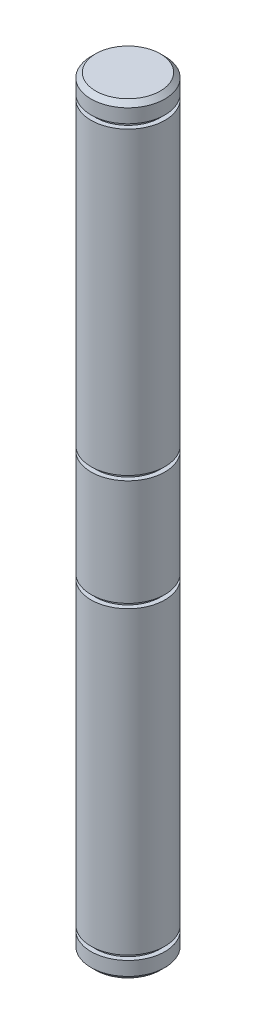
ISO-10303-21;
HEADER;
FILE_DESCRIPTION(('STEP AP214'),'2;1');
FILE_NAME('part.step','',(''),(''),'','','');
FILE_SCHEMA(('AUTOMOTIVE_DESIGN { 1 0 10303 214 1 1 1 1 }'));
ENDSEC;
DATA;
#1=APPLICATION_CONTEXT('core data for automotive mechanical design processes');
#2=APPLICATION_PROTOCOL_DEFINITION('international standard','automotive_design',2000,#1);
#3=PRODUCT_CONTEXT('',#1,'mechanical');
#4=PRODUCT('Part','Part','',(#3));
#5=PRODUCT_RELATED_PRODUCT_CATEGORY('part','',(#4));
#6=PRODUCT_DEFINITION_FORMATION('','',#4);
#7=PRODUCT_DEFINITION_CONTEXT('part definition',#1,'design');
#8=PRODUCT_DEFINITION('design','',#6,#7);
#9=PRODUCT_DEFINITION_SHAPE('','',#8);
#10=(LENGTH_UNIT() NAMED_UNIT(*) SI_UNIT(.MILLI.,.METRE.));
#11=(NAMED_UNIT(*) PLANE_ANGLE_UNIT() SI_UNIT($,.RADIAN.));
#12=(NAMED_UNIT(*) SI_UNIT($,.STERADIAN.) SOLID_ANGLE_UNIT());
#13=UNCERTAINTY_MEASURE_WITH_UNIT(LENGTH_MEASURE(1.E-05),#10,'distance_accuracy_value','');
#14=(GEOMETRIC_REPRESENTATION_CONTEXT(3) GLOBAL_UNCERTAINTY_ASSIGNED_CONTEXT((#13)) GLOBAL_UNIT_ASSIGNED_CONTEXT((#10,
#11,#12)) REPRESENTATION_CONTEXT('',''));
#15=CARTESIAN_POINT('',(0.,0.,0.));
#16=DIRECTION('',(0.,0.,1.));
#17=DIRECTION('',(1.,0.,0.));
#18=AXIS2_PLACEMENT_3D('',#15,#16,#17);
#19=CARTESIAN_POINT('',(0.,82.5,0.));
#20=DIRECTION('',(0.,1.,0.));
#21=DIRECTION('',(-1.,0.,0.));
#22=AXIS2_PLACEMENT_3D('',#19,#20,#21);
#23=CYLINDRICAL_SURFACE('',#22,8.);
#24=CARTESIAN_POINT('',(0.,11.5,0.));
#25=DIRECTION('',(0.,1.,0.));
#26=DIRECTION('',(-1.,0.,0.));
#27=AXIS2_PLACEMENT_3D('',#24,#25,#26);
#28=CIRCLE('',#27,8.);
#29=CARTESIAN_POINT('',(-8.,11.5,0.));
#30=VERTEX_POINT('',#29);
#31=EDGE_CURVE('E54',#30,#30,#28,.T.);
#32=ORIENTED_EDGE('',*,*,#31,.F.);
#33=EDGE_LOOP('',(#32));
#34=FACE_BOUND('',#33,.T.);
#35=CARTESIAN_POINT('',(0.,-11.5,0.));
#36=DIRECTION('',(0.,1.,0.));
#37=DIRECTION('',(-1.,0.,0.));
#38=AXIS2_PLACEMENT_3D('',#35,#36,#37);
#39=CIRCLE('',#38,8.);
#40=CARTESIAN_POINT('',(-8.,-11.5,0.));
#41=VERTEX_POINT('',#40);
#42=EDGE_CURVE('E78',#41,#41,#39,.T.);
#43=ORIENTED_EDGE('',*,*,#42,.T.);
#44=EDGE_LOOP('',(#43));
#45=FACE_BOUND('',#44,.T.);
#46=ADVANCED_FACE('F34',(#34,#45),#23,.T.);
#47=CARTESIAN_POINT('',(8.,11.5,0.));
#48=DIRECTION('',(0.,-1.,0.));
#49=DIRECTION('',(1.,0.,0.));
#50=AXIS2_PLACEMENT_3D('',#47,#48,#49);
#51=PLANE('',#50);
#52=CARTESIAN_POINT('',(0.,11.5,0.));
#53=DIRECTION('',(0.,1.,0.));
#54=DIRECTION('',(-1.,0.,0.));
#55=AXIS2_PLACEMENT_3D('',#52,#53,#54);
#56=CIRCLE('',#55,7.);
#57=CARTESIAN_POINT('',(-7.,11.5,0.));
#58=VERTEX_POINT('',#57);
#59=EDGE_CURVE('E57',#58,#58,#56,.T.);
#60=ORIENTED_EDGE('',*,*,#59,.F.);
#61=EDGE_LOOP('',(#60));
#62=FACE_BOUND('',#61,.T.);
#63=ORIENTED_EDGE('',*,*,#31,.T.);
#64=EDGE_LOOP('',(#63));
#65=FACE_BOUND('',#64,.T.);
#66=ADVANCED_FACE('F119',(#62,#65),#51,.F.);
#67=CARTESIAN_POINT('',(0.,82.5,0.));
#68=DIRECTION('',(0.,1.,0.));
#69=DIRECTION('',(-1.,0.,0.));
#70=AXIS2_PLACEMENT_3D('',#67,#68,#69);
#71=CYLINDRICAL_SURFACE('',#70,7.);
#72=CARTESIAN_POINT('',(0.,12.5,0.));
#73=DIRECTION('',(0.,1.,0.));
#74=DIRECTION('',(-1.,0.,0.));
#75=AXIS2_PLACEMENT_3D('',#72,#73,#74);
#76=CIRCLE('',#75,7.);
#77=CARTESIAN_POINT('',(-7.,12.5,0.));
#78=VERTEX_POINT('',#77);
#79=EDGE_CURVE('E60',#78,#78,#76,.T.);
#80=ORIENTED_EDGE('',*,*,#79,.F.);
#81=EDGE_LOOP('',(#80));
#82=FACE_BOUND('',#81,.T.);
#83=ORIENTED_EDGE('',*,*,#59,.T.);
#84=EDGE_LOOP('',(#83));
#85=FACE_BOUND('',#84,.T.);
#86=ADVANCED_FACE('F125',(#82,#85),#71,.T.);
#87=CARTESIAN_POINT('',(7.,12.5,0.));
#88=DIRECTION('',(0.,1.,0.));
#89=DIRECTION('',(-1.,0.,0.));
#90=AXIS2_PLACEMENT_3D('',#87,#88,#89);
#91=PLANE('',#90);
#92=CARTESIAN_POINT('',(0.,12.5,0.));
#93=DIRECTION('',(0.,1.,0.));
#94=DIRECTION('',(-1.,0.,0.));
#95=AXIS2_PLACEMENT_3D('',#92,#93,#94);
#96=CIRCLE('',#95,8.);
#97=CARTESIAN_POINT('',(-8.,12.5,0.));
#98=VERTEX_POINT('',#97);
#99=EDGE_CURVE('E63',#98,#98,#96,.T.);
#100=ORIENTED_EDGE('',*,*,#99,.F.);
#101=EDGE_LOOP('',(#100));
#102=FACE_BOUND('',#101,.T.);
#103=ORIENTED_EDGE('',*,*,#79,.T.);
#104=EDGE_LOOP('',(#103));
#105=FACE_BOUND('',#104,.T.);
#106=ADVANCED_FACE('F172',(#102,#105),#91,.F.);
#107=CARTESIAN_POINT('',(0.,82.5,0.));
#108=DIRECTION('',(0.,1.,0.));
#109=DIRECTION('',(-1.,0.,0.));
#110=AXIS2_PLACEMENT_3D('',#107,#108,#109);
#111=CYLINDRICAL_SURFACE('',#110,8.);
#112=CARTESIAN_POINT('',(0.,77.5,0.));
#113=DIRECTION('',(0.,1.,0.));
#114=DIRECTION('',(-1.,0.,0.));
#115=AXIS2_PLACEMENT_3D('',#112,#113,#114);
#116=CIRCLE('',#115,8.);
#117=CARTESIAN_POINT('',(-8.00000000000001,77.5,0.));
#118=VERTEX_POINT('',#117);
#119=EDGE_CURVE('E66',#118,#118,#116,.T.);
#120=ORIENTED_EDGE('',*,*,#119,.F.);
#121=EDGE_LOOP('',(#120));
#122=FACE_BOUND('',#121,.T.);
#123=ORIENTED_EDGE('',*,*,#99,.T.);
#124=EDGE_LOOP('',(#123));
#125=FACE_BOUND('',#124,.T.);
#126=ADVANCED_FACE('F168',(#122,#125),#111,.T.);
#127=CARTESIAN_POINT('',(8.,77.5,0.));
#128=DIRECTION('',(0.,-1.,0.));
#129=DIRECTION('',(1.,0.,0.));
#130=AXIS2_PLACEMENT_3D('',#127,#128,#129);
#131=PLANE('',#130);
#132=CARTESIAN_POINT('',(0.,77.5,0.));
#133=DIRECTION('',(0.,1.,0.));
#134=DIRECTION('',(-1.,0.,0.));
#135=AXIS2_PLACEMENT_3D('',#132,#133,#134);
#136=CIRCLE('',#135,7.);
#137=CARTESIAN_POINT('',(-7.00000000000001,77.5,0.));
#138=VERTEX_POINT('',#137);
#139=EDGE_CURVE('E69',#138,#138,#136,.T.);
#140=ORIENTED_EDGE('',*,*,#139,.F.);
#141=EDGE_LOOP('',(#140));
#142=FACE_BOUND('',#141,.T.);
#143=ORIENTED_EDGE('',*,*,#119,.T.);
#144=EDGE_LOOP('',(#143));
#145=FACE_BOUND('',#144,.T.);
#146=ADVANCED_FACE('F164',(#142,#145),#131,.F.);
#147=CARTESIAN_POINT('',(0.,82.5,0.));
#148=DIRECTION('',(0.,1.,0.));
#149=DIRECTION('',(-1.,0.,0.));
#150=AXIS2_PLACEMENT_3D('',#147,#148,#149);
#151=CYLINDRICAL_SURFACE('',#150,7.);
#152=CARTESIAN_POINT('',(0.,78.5,0.));
#153=DIRECTION('',(0.,1.,0.));
#154=DIRECTION('',(-1.,0.,0.));
#155=AXIS2_PLACEMENT_3D('',#152,#153,#154);
#156=CIRCLE('',#155,7.);
#157=CARTESIAN_POINT('',(-7.00000000000001,78.5,0.));
#158=VERTEX_POINT('',#157);
#159=EDGE_CURVE('E72',#158,#158,#156,.T.);
#160=ORIENTED_EDGE('',*,*,#159,.F.);
#161=EDGE_LOOP('',(#160));
#162=FACE_BOUND('',#161,.T.);
#163=ORIENTED_EDGE('',*,*,#139,.T.);
#164=EDGE_LOOP('',(#163));
#165=FACE_BOUND('',#164,.T.);
#166=ADVANCED_FACE('F160',(#162,#165),#151,.T.);
#167=CARTESIAN_POINT('',(7.,78.5,0.));
#168=DIRECTION('',(0.,1.,0.));
#169=DIRECTION('',(-1.,0.,0.));
#170=AXIS2_PLACEMENT_3D('',#167,#168,#169);
#171=PLANE('',#170);
#172=CARTESIAN_POINT('',(0.,78.5,0.));
#173=DIRECTION('',(0.,1.,0.));
#174=DIRECTION('',(-1.,0.,0.));
#175=AXIS2_PLACEMENT_3D('',#172,#173,#174);
#176=CIRCLE('',#175,8.);
#177=CARTESIAN_POINT('',(-8.00000000000001,78.5,0.));
#178=VERTEX_POINT('',#177);
#179=EDGE_CURVE('E75',#178,#178,#176,.T.);
#180=ORIENTED_EDGE('',*,*,#179,.F.);
#181=EDGE_LOOP('',(#180));
#182=FACE_BOUND('',#181,.T.);
#183=ORIENTED_EDGE('',*,*,#159,.T.);
#184=EDGE_LOOP('',(#183));
#185=FACE_BOUND('',#184,.T.);
#186=ADVANCED_FACE('F153',(#182,#185),#171,.F.);
#187=CARTESIAN_POINT('',(0.,82.5,0.));
#188=DIRECTION('',(0.,1.,0.));
#189=DIRECTION('',(-1.,0.,0.));
#190=AXIS2_PLACEMENT_3D('',#187,#188,#189);
#191=CYLINDRICAL_SURFACE('',#190,8.);
#192=CARTESIAN_POINT('',(0.,81.5,0.));
#193=DIRECTION('',(0.,-1.,0.));
#194=DIRECTION('',(1.,0.,0.));
#195=AXIS2_PLACEMENT_3D('',#192,#193,#194);
#196=CIRCLE('',#195,8.);
#197=CARTESIAN_POINT('',(8.,81.5,0.));
#198=VERTEX_POINT('',#197);
#199=EDGE_CURVE('E45',#198,#198,#196,.T.);
#200=ORIENTED_EDGE('',*,*,#199,.T.);
#201=EDGE_LOOP('',(#200));
#202=FACE_BOUND('',#201,.T.);
#203=ORIENTED_EDGE('',*,*,#179,.T.);
#204=EDGE_LOOP('',(#203));
#205=FACE_BOUND('',#204,.T.);
#206=ADVANCED_FACE('F144',(#202,#205),#191,.T.);
#207=CARTESIAN_POINT('',(8.,82.5,0.));
#208=DIRECTION('',(0.,-1.,0.));
#209=DIRECTION('',(1.,0.,0.));
#210=AXIS2_PLACEMENT_3D('',#207,#208,#209);
#211=PLANE('',#210);
#212=CARTESIAN_POINT('',(0.,82.5,0.));
#213=DIRECTION('',(0.,-1.,0.));
#214=DIRECTION('',(1.,0.,0.));
#215=AXIS2_PLACEMENT_3D('',#212,#213,#214);
#216=CIRCLE('',#215,6.99999999999999);
#217=CARTESIAN_POINT('',(6.99999999999999,82.5,0.));
#218=VERTEX_POINT('',#217);
#219=EDGE_CURVE('E49',#218,#218,#216,.F.);
#220=ORIENTED_EDGE('',*,*,#219,.T.);
#221=EDGE_LOOP('',(#220));
#222=FACE_BOUND('',#221,.T.);
#223=ADVANCED_FACE('F141',(#222),#211,.F.);
#224=CARTESIAN_POINT('',(8.,-11.5,0.));
#225=DIRECTION('',(0.,1.,0.));
#226=DIRECTION('',(1.,0.,0.));
#227=AXIS2_PLACEMENT_3D('',#224,#225,#226);
#228=PLANE('',#227);
#229=CARTESIAN_POINT('',(0.,-11.5,0.));
#230=DIRECTION('',(0.,1.,0.));
#231=DIRECTION('',(-1.,0.,0.));
#232=AXIS2_PLACEMENT_3D('',#229,#230,#231);
#233=CIRCLE('',#232,7.);
#234=CARTESIAN_POINT('',(-7.,-11.5,0.));
#235=VERTEX_POINT('',#234);
#236=EDGE_CURVE('E81',#235,#235,#233,.T.);
#237=ORIENTED_EDGE('',*,*,#236,.T.);
#238=EDGE_LOOP('',(#237));
#239=FACE_BOUND('',#238,.T.);
#240=ORIENTED_EDGE('',*,*,#42,.F.);
#241=EDGE_LOOP('',(#240));
#242=FACE_BOUND('',#241,.T.);
#243=ADVANCED_FACE('F143',(#239,#242),#228,.F.);
#244=CARTESIAN_POINT('',(0.,-82.5,0.));
#245=DIRECTION('',(0.,-1.,0.));
#246=DIRECTION('',(-1.,0.,0.));
#247=AXIS2_PLACEMENT_3D('',#244,#245,#246);
#248=CYLINDRICAL_SURFACE('',#247,7.);
#249=CARTESIAN_POINT('',(0.,-12.5,0.));
#250=DIRECTION('',(0.,1.,0.));
#251=DIRECTION('',(-1.,0.,0.));
#252=AXIS2_PLACEMENT_3D('',#249,#250,#251);
#253=CIRCLE('',#252,7.);
#254=CARTESIAN_POINT('',(-7.,-12.5,0.));
#255=VERTEX_POINT('',#254);
#256=EDGE_CURVE('E84',#255,#255,#253,.T.);
#257=ORIENTED_EDGE('',*,*,#256,.T.);
#258=EDGE_LOOP('',(#257));
#259=FACE_BOUND('',#258,.T.);
#260=ORIENTED_EDGE('',*,*,#236,.F.);
#261=EDGE_LOOP('',(#260));
#262=FACE_BOUND('',#261,.T.);
#263=ADVANCED_FACE('F150',(#259,#262),#248,.T.);
#264=CARTESIAN_POINT('',(7.,-12.5,0.));
#265=DIRECTION('',(0.,-1.,0.));
#266=DIRECTION('',(-1.,0.,0.));
#267=AXIS2_PLACEMENT_3D('',#264,#265,#266);
#268=PLANE('',#267);
#269=CARTESIAN_POINT('',(0.,-12.5,0.));
#270=DIRECTION('',(0.,1.,0.));
#271=DIRECTION('',(-1.,0.,0.));
#272=AXIS2_PLACEMENT_3D('',#269,#270,#271);
#273=CIRCLE('',#272,8.);
#274=CARTESIAN_POINT('',(-8.,-12.5,0.));
#275=VERTEX_POINT('',#274);
#276=EDGE_CURVE('E87',#275,#275,#273,.T.);
#277=ORIENTED_EDGE('',*,*,#276,.T.);
#278=EDGE_LOOP('',(#277));
#279=FACE_BOUND('',#278,.T.);
#280=ORIENTED_EDGE('',*,*,#256,.F.);
#281=EDGE_LOOP('',(#280));
#282=FACE_BOUND('',#281,.T.);
#283=ADVANCED_FACE('F269',(#279,#282),#268,.F.);
#284=CARTESIAN_POINT('',(0.,-82.5,0.));
#285=DIRECTION('',(0.,-1.,0.));
#286=DIRECTION('',(-1.,0.,0.));
#287=AXIS2_PLACEMENT_3D('',#284,#285,#286);
#288=CYLINDRICAL_SURFACE('',#287,8.);
#289=CARTESIAN_POINT('',(0.,-77.5,0.));
#290=DIRECTION('',(0.,1.,0.));
#291=DIRECTION('',(-1.,0.,0.));
#292=AXIS2_PLACEMENT_3D('',#289,#290,#291);
#293=CIRCLE('',#292,8.);
#294=CARTESIAN_POINT('',(-8.00000000000001,-77.5,0.));
#295=VERTEX_POINT('',#294);
#296=EDGE_CURVE('E90',#295,#295,#293,.T.);
#297=ORIENTED_EDGE('',*,*,#296,.T.);
#298=EDGE_LOOP('',(#297));
#299=FACE_BOUND('',#298,.T.);
#300=ORIENTED_EDGE('',*,*,#276,.F.);
#301=EDGE_LOOP('',(#300));
#302=FACE_BOUND('',#301,.T.);
#303=ADVANCED_FACE('F260',(#299,#302),#288,.T.);
#304=CARTESIAN_POINT('',(8.,-77.5,0.));
#305=DIRECTION('',(0.,1.,0.));
#306=DIRECTION('',(1.,0.,0.));
#307=AXIS2_PLACEMENT_3D('',#304,#305,#306);
#308=PLANE('',#307);
#309=CARTESIAN_POINT('',(0.,-77.5,0.));
#310=DIRECTION('',(0.,1.,0.));
#311=DIRECTION('',(-1.,0.,0.));
#312=AXIS2_PLACEMENT_3D('',#309,#310,#311);
#313=CIRCLE('',#312,7.);
#314=CARTESIAN_POINT('',(-7.00000000000001,-77.5,0.));
#315=VERTEX_POINT('',#314);
#316=EDGE_CURVE('E93',#315,#315,#313,.T.);
#317=ORIENTED_EDGE('',*,*,#316,.T.);
#318=EDGE_LOOP('',(#317));
#319=FACE_BOUND('',#318,.T.);
#320=ORIENTED_EDGE('',*,*,#296,.F.);
#321=EDGE_LOOP('',(#320));
#322=FACE_BOUND('',#321,.T.);
#323=ADVANCED_FACE('F251',(#319,#322),#308,.F.);
#324=CARTESIAN_POINT('',(0.,-82.5,0.));
#325=DIRECTION('',(0.,-1.,0.));
#326=DIRECTION('',(-1.,0.,0.));
#327=AXIS2_PLACEMENT_3D('',#324,#325,#326);
#328=CYLINDRICAL_SURFACE('',#327,7.);
#329=CARTESIAN_POINT('',(0.,-78.5,0.));
#330=DIRECTION('',(0.,1.,0.));
#331=DIRECTION('',(-1.,0.,0.));
#332=AXIS2_PLACEMENT_3D('',#329,#330,#331);
#333=CIRCLE('',#332,7.);
#334=CARTESIAN_POINT('',(-7.00000000000001,-78.5,0.));
#335=VERTEX_POINT('',#334);
#336=EDGE_CURVE('E96',#335,#335,#333,.T.);
#337=ORIENTED_EDGE('',*,*,#336,.T.);
#338=EDGE_LOOP('',(#337));
#339=FACE_BOUND('',#338,.T.);
#340=ORIENTED_EDGE('',*,*,#316,.F.);
#341=EDGE_LOOP('',(#340));
#342=FACE_BOUND('',#341,.T.);
#343=ADVANCED_FACE('F116',(#339,#342),#328,.T.);
#344=CARTESIAN_POINT('',(7.,-78.5,0.));
#345=DIRECTION('',(0.,-1.,0.));
#346=DIRECTION('',(-1.,0.,0.));
#347=AXIS2_PLACEMENT_3D('',#344,#345,#346);
#348=PLANE('',#347);
#349=CARTESIAN_POINT('',(0.,-78.5,0.));
#350=DIRECTION('',(0.,1.,0.));
#351=DIRECTION('',(-1.,0.,0.));
#352=AXIS2_PLACEMENT_3D('',#349,#350,#351);
#353=CIRCLE('',#352,8.);
#354=CARTESIAN_POINT('',(-8.00000000000001,-78.5,0.));
#355=VERTEX_POINT('',#354);
#356=EDGE_CURVE('E99',#355,#355,#353,.T.);
#357=ORIENTED_EDGE('',*,*,#356,.T.);
#358=EDGE_LOOP('',(#357));
#359=FACE_BOUND('',#358,.T.);
#360=ORIENTED_EDGE('',*,*,#336,.F.);
#361=EDGE_LOOP('',(#360));
#362=FACE_BOUND('',#361,.T.);
#363=ADVANCED_FACE('F103',(#359,#362),#348,.F.);
#364=CARTESIAN_POINT('',(0.,-82.5,0.));
#365=DIRECTION('',(0.,-1.,0.));
#366=DIRECTION('',(-1.,0.,0.));
#367=AXIS2_PLACEMENT_3D('',#364,#365,#366);
#368=CYLINDRICAL_SURFACE('',#367,8.);
#369=CARTESIAN_POINT('',(0.,-81.5,0.));
#370=DIRECTION('',(0.,1.,0.));
#371=DIRECTION('',(-1.,0.,0.));
#372=AXIS2_PLACEMENT_3D('',#369,#370,#371);
#373=CIRCLE('',#372,8.);
#374=CARTESIAN_POINT('',(-8.00000000000001,-81.5,0.));
#375=VERTEX_POINT('',#374);
#376=EDGE_CURVE('E41',#375,#375,#373,.T.);
#377=ORIENTED_EDGE('',*,*,#376,.T.);
#378=EDGE_LOOP('',(#377));
#379=FACE_BOUND('',#378,.T.);
#380=ORIENTED_EDGE('',*,*,#356,.F.);
#381=EDGE_LOOP('',(#380));
#382=FACE_BOUND('',#381,.T.);
#383=ADVANCED_FACE('F106',(#379,#382),#368,.T.);
#384=CARTESIAN_POINT('',(8.,-82.5,0.));
#385=DIRECTION('',(0.,1.,0.));
#386=DIRECTION('',(1.,0.,0.));
#387=AXIS2_PLACEMENT_3D('',#384,#385,#386);
#388=PLANE('',#387);
#389=CARTESIAN_POINT('',(0.,-82.5,0.));
#390=DIRECTION('',(0.,1.,0.));
#391=DIRECTION('',(-1.,0.,0.));
#392=AXIS2_PLACEMENT_3D('',#389,#390,#391);
#393=CIRCLE('',#392,6.99999999999999);
#394=CARTESIAN_POINT('',(-7.,-82.5,0.));
#395=VERTEX_POINT('',#394);
#396=EDGE_CURVE('E10',#395,#395,#393,.F.);
#397=ORIENTED_EDGE('',*,*,#396,.T.);
#398=EDGE_LOOP('',(#397));
#399=FACE_BOUND('',#398,.T.);
#400=ADVANCED_FACE('F108',(#399),#388,.F.);
#401=CARTESIAN_POINT('',(0.,82.5,0.));
#402=DIRECTION('',(0.,-1.,0.));
#403=DIRECTION('',(1.,0.,0.));
#404=AXIS2_PLACEMENT_3D('',#401,#402,#403);
#405=CONICAL_SURFACE('',#404,6.99999999999999,0.785398163397447);
#406=ORIENTED_EDGE('',*,*,#199,.F.);
#407=EDGE_LOOP('',(#406));
#408=FACE_BOUND('',#407,.T.);
#409=ORIENTED_EDGE('',*,*,#219,.F.);
#410=EDGE_LOOP('',(#409));
#411=FACE_BOUND('',#410,.T.);
#412=ADVANCED_FACE('F114',(#408,#411),#405,.T.);
#413=CARTESIAN_POINT('',(0.,-81.5,0.));
#414=DIRECTION('',(0.,1.,0.));
#415=DIRECTION('',(-1.,0.,0.));
#416=AXIS2_PLACEMENT_3D('',#413,#414,#415);
#417=CONICAL_SURFACE('',#416,8.,0.785398163397454);
#418=ORIENTED_EDGE('',*,*,#396,.F.);
#419=EDGE_LOOP('',(#418));
#420=FACE_BOUND('',#419,.T.);
#421=ORIENTED_EDGE('',*,*,#376,.F.);
#422=EDGE_LOOP('',(#421));
#423=FACE_BOUND('',#422,.T.);
#424=ADVANCED_FACE('F36',(#420,#423),#417,.T.);
#425=CLOSED_SHELL('',(#46,#66,#86,#106,#126,#146,#166,#186,#206,#223,#243,#263,#283,#303,#323,
#343,#363,#383,#400,#412,#424));
#426=MANIFOLD_SOLID_BREP('B2',#425);
#427=ADVANCED_BREP_SHAPE_REPRESENTATION('',(#18,#426),#14);
#428=SHAPE_DEFINITION_REPRESENTATION(#9,#427);
ENDSEC;
END-ISO-10303-21;
